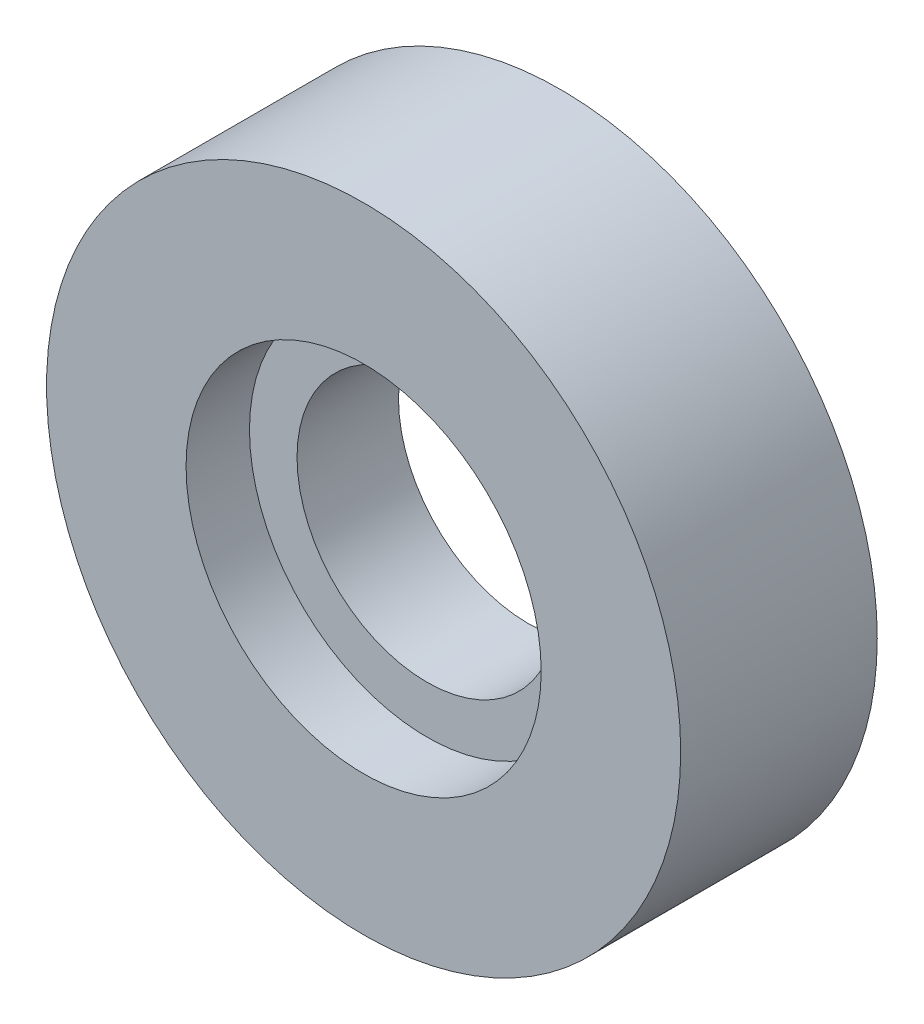
ISO-10303-21;
HEADER;
FILE_DESCRIPTION(('STEP AP214'),'2;1');
FILE_NAME('part.step','',(''),(''),'','','');
FILE_SCHEMA(('AUTOMOTIVE_DESIGN { 1 0 10303 214 1 1 1 1 }'));
ENDSEC;
DATA;
#1=APPLICATION_CONTEXT('core data for automotive mechanical design processes');
#2=APPLICATION_PROTOCOL_DEFINITION('international standard','automotive_design',2000,#1);
#3=PRODUCT_CONTEXT('',#1,'mechanical');
#4=PRODUCT('Part','Part','',(#3));
#5=PRODUCT_RELATED_PRODUCT_CATEGORY('part','',(#4));
#6=PRODUCT_DEFINITION_FORMATION('','',#4);
#7=PRODUCT_DEFINITION_CONTEXT('part definition',#1,'design');
#8=PRODUCT_DEFINITION('design','',#6,#7);
#9=PRODUCT_DEFINITION_SHAPE('','',#8);
#10=(LENGTH_UNIT() NAMED_UNIT(*) SI_UNIT(.MILLI.,.METRE.));
#11=(NAMED_UNIT(*) PLANE_ANGLE_UNIT() SI_UNIT($,.RADIAN.));
#12=(NAMED_UNIT(*) SI_UNIT($,.STERADIAN.) SOLID_ANGLE_UNIT());
#13=UNCERTAINTY_MEASURE_WITH_UNIT(LENGTH_MEASURE(1.E-05),#10,'distance_accuracy_value','');
#14=(GEOMETRIC_REPRESENTATION_CONTEXT(3) GLOBAL_UNCERTAINTY_ASSIGNED_CONTEXT((#13)) GLOBAL_UNIT_ASSIGNED_CONTEXT((#10,
#11,#12)) REPRESENTATION_CONTEXT('',''));
#15=CARTESIAN_POINT('',(0.,0.,0.));
#16=DIRECTION('',(0.,0.,1.));
#17=DIRECTION('',(1.,0.,0.));
#18=AXIS2_PLACEMENT_3D('',#15,#16,#17);
#19=CARTESIAN_POINT('',(0.,0.,0.));
#20=DIRECTION('',(0.,0.,1.));
#21=DIRECTION('',(1.,0.,0.));
#22=AXIS2_PLACEMENT_3D('',#19,#20,#21);
#23=CYLINDRICAL_SURFACE('',#22,34.);
#24=CARTESIAN_POINT('',(0.,0.,-31.));
#25=DIRECTION('',(0.,0.,1.));
#26=DIRECTION('',(1.,0.,0.));
#27=AXIS2_PLACEMENT_3D('',#24,#25,#26);
#28=CIRCLE('',#27,34.);
#29=CARTESIAN_POINT('',(34.,0.,-31.));
#30=VERTEX_POINT('',#29);
#31=EDGE_CURVE('E10',#30,#30,#28,.T.);
#32=ORIENTED_EDGE('',*,*,#31,.F.);
#33=EDGE_LOOP('',(#32));
#34=FACE_BOUND('',#33,.T.);
#35=CARTESIAN_POINT('',(0.,0.,-26.));
#36=DIRECTION('',(0.,0.,1.));
#37=DIRECTION('',(1.,0.,0.));
#38=AXIS2_PLACEMENT_3D('',#35,#36,#37);
#39=CIRCLE('',#38,34.);
#40=CARTESIAN_POINT('',(34.,0.,-26.));
#41=VERTEX_POINT('',#40);
#42=EDGE_CURVE('E70',#41,#41,#39,.T.);
#43=ORIENTED_EDGE('',*,*,#42,.T.);
#44=EDGE_LOOP('',(#43));
#45=FACE_BOUND('',#44,.T.);
#46=ADVANCED_FACE('F33',(#34,#45),#23,.F.);
#47=CARTESIAN_POINT('',(0.,34.,-31.));
#48=DIRECTION('',(0.,0.,1.));
#49=DIRECTION('',(1.,0.,0.));
#50=AXIS2_PLACEMENT_3D('',#47,#48,#49);
#51=PLANE('',#50);
#52=CARTESIAN_POINT('',(0.,0.,-31.));
#53=DIRECTION('',(0.,0.,1.));
#54=DIRECTION('',(1.,0.,0.));
#55=AXIS2_PLACEMENT_3D('',#52,#53,#54);
#56=CIRCLE('',#55,50.);
#57=CARTESIAN_POINT('',(50.,0.,-31.));
#58=VERTEX_POINT('',#57);
#59=EDGE_CURVE('E40',#58,#58,#56,.T.);
#60=ORIENTED_EDGE('',*,*,#59,.F.);
#61=EDGE_LOOP('',(#60));
#62=FACE_BOUND('',#61,.T.);
#63=ORIENTED_EDGE('',*,*,#31,.T.);
#64=EDGE_LOOP('',(#63));
#65=FACE_BOUND('',#64,.T.);
#66=ADVANCED_FACE('F109',(#62,#65),#51,.F.);
#67=CARTESIAN_POINT('',(0.,0.,0.));
#68=DIRECTION('',(0.,0.,1.));
#69=DIRECTION('',(1.,0.,0.));
#70=AXIS2_PLACEMENT_3D('',#67,#68,#69);
#71=CYLINDRICAL_SURFACE('',#70,50.);
#72=CARTESIAN_POINT('',(0.,0.,0.));
#73=DIRECTION('',(0.,0.,1.));
#74=DIRECTION('',(1.,0.,0.));
#75=AXIS2_PLACEMENT_3D('',#72,#73,#74);
#76=CIRCLE('',#75,50.);
#77=CARTESIAN_POINT('',(50.,0.,0.));
#78=VERTEX_POINT('',#77);
#79=EDGE_CURVE('E46',#78,#78,#76,.T.);
#80=ORIENTED_EDGE('',*,*,#79,.F.);
#81=EDGE_LOOP('',(#80));
#82=FACE_BOUND('',#81,.T.);
#83=ORIENTED_EDGE('',*,*,#59,.T.);
#84=EDGE_LOOP('',(#83));
#85=FACE_BOUND('',#84,.T.);
#86=ADVANCED_FACE('F104',(#82,#85),#71,.T.);
#87=CARTESIAN_POINT('',(0.,28.,0.));
#88=DIRECTION('',(0.,0.,-1.));
#89=DIRECTION('',(-1.,0.,0.));
#90=AXIS2_PLACEMENT_3D('',#87,#88,#89);
#91=PLANE('',#90);
#92=CARTESIAN_POINT('',(0.,0.,0.));
#93=DIRECTION('',(0.,0.,1.));
#94=DIRECTION('',(1.,0.,0.));
#95=AXIS2_PLACEMENT_3D('',#92,#93,#94);
#96=CIRCLE('',#95,28.);
#97=CARTESIAN_POINT('',(28.,0.,0.));
#98=VERTEX_POINT('',#97);
#99=EDGE_CURVE('E52',#98,#98,#96,.T.);
#100=ORIENTED_EDGE('',*,*,#99,.F.);
#101=EDGE_LOOP('',(#100));
#102=FACE_BOUND('',#101,.T.);
#103=ORIENTED_EDGE('',*,*,#79,.T.);
#104=EDGE_LOOP('',(#103));
#105=FACE_BOUND('',#104,.T.);
#106=ADVANCED_FACE('F98',(#102,#105),#91,.F.);
#107=CARTESIAN_POINT('',(0.,0.,0.));
#108=DIRECTION('',(0.,0.,1.));
#109=DIRECTION('',(1.,0.,0.));
#110=AXIS2_PLACEMENT_3D('',#107,#108,#109);
#111=CYLINDRICAL_SURFACE('',#110,28.);
#112=CARTESIAN_POINT('',(0.,0.,-10.));
#113=DIRECTION('',(0.,0.,1.));
#114=DIRECTION('',(1.,0.,0.));
#115=AXIS2_PLACEMENT_3D('',#112,#113,#114);
#116=CIRCLE('',#115,28.);
#117=CARTESIAN_POINT('',(28.,0.,-10.));
#118=VERTEX_POINT('',#117);
#119=EDGE_CURVE('E58',#118,#118,#116,.T.);
#120=ORIENTED_EDGE('',*,*,#119,.F.);
#121=EDGE_LOOP('',(#120));
#122=FACE_BOUND('',#121,.T.);
#123=ORIENTED_EDGE('',*,*,#99,.T.);
#124=EDGE_LOOP('',(#123));
#125=FACE_BOUND('',#124,.T.);
#126=ADVANCED_FACE('F92',(#122,#125),#111,.F.);
#127=CARTESIAN_POINT('',(0.,28.,-10.));
#128=DIRECTION('',(0.,0.,-1.));
#129=DIRECTION('',(-1.,0.,0.));
#130=AXIS2_PLACEMENT_3D('',#127,#128,#129);
#131=PLANE('',#130);
#132=CARTESIAN_POINT('',(0.,0.,-10.));
#133=DIRECTION('',(0.,0.,1.));
#134=DIRECTION('',(1.,0.,0.));
#135=AXIS2_PLACEMENT_3D('',#132,#133,#134);
#136=CIRCLE('',#135,20.5);
#137=CARTESIAN_POINT('',(20.5,0.,-10.));
#138=VERTEX_POINT('',#137);
#139=EDGE_CURVE('E62',#138,#138,#136,.T.);
#140=ORIENTED_EDGE('',*,*,#139,.F.);
#141=EDGE_LOOP('',(#140));
#142=FACE_BOUND('',#141,.T.);
#143=ORIENTED_EDGE('',*,*,#119,.T.);
#144=EDGE_LOOP('',(#143));
#145=FACE_BOUND('',#144,.T.);
#146=ADVANCED_FACE('F86',(#142,#145),#131,.F.);
#147=CARTESIAN_POINT('',(0.,0.,0.));
#148=DIRECTION('',(0.,0.,1.));
#149=DIRECTION('',(1.,0.,0.));
#150=AXIS2_PLACEMENT_3D('',#147,#148,#149);
#151=CYLINDRICAL_SURFACE('',#150,20.5);
#152=CARTESIAN_POINT('',(0.,0.,-26.));
#153=DIRECTION('',(0.,0.,1.));
#154=DIRECTION('',(1.,0.,0.));
#155=AXIS2_PLACEMENT_3D('',#152,#153,#154);
#156=CIRCLE('',#155,20.5);
#157=CARTESIAN_POINT('',(20.5,0.,-26.));
#158=VERTEX_POINT('',#157);
#159=EDGE_CURVE('E66',#158,#158,#156,.T.);
#160=ORIENTED_EDGE('',*,*,#159,.F.);
#161=EDGE_LOOP('',(#160));
#162=FACE_BOUND('',#161,.T.);
#163=ORIENTED_EDGE('',*,*,#139,.T.);
#164=EDGE_LOOP('',(#163));
#165=FACE_BOUND('',#164,.T.);
#166=ADVANCED_FACE('F80',(#162,#165),#151,.F.);
#167=CARTESIAN_POINT('',(0.,20.5,-26.));
#168=DIRECTION('',(0.,0.,1.));
#169=DIRECTION('',(1.,0.,0.));
#170=AXIS2_PLACEMENT_3D('',#167,#168,#169);
#171=PLANE('',#170);
#172=ORIENTED_EDGE('',*,*,#42,.F.);
#173=EDGE_LOOP('',(#172));
#174=FACE_BOUND('',#173,.T.);
#175=ORIENTED_EDGE('',*,*,#159,.T.);
#176=EDGE_LOOP('',(#175));
#177=FACE_BOUND('',#176,.T.);
#178=ADVANCED_FACE('F77',(#174,#177),#171,.F.);
#179=CLOSED_SHELL('',(#46,#66,#86,#106,#126,#146,#166,#178));
#180=MANIFOLD_SOLID_BREP('B2',#179);
#181=ADVANCED_BREP_SHAPE_REPRESENTATION('',(#18,#180),#14);
#182=SHAPE_DEFINITION_REPRESENTATION(#9,#181);
ENDSEC;
END-ISO-10303-21;
